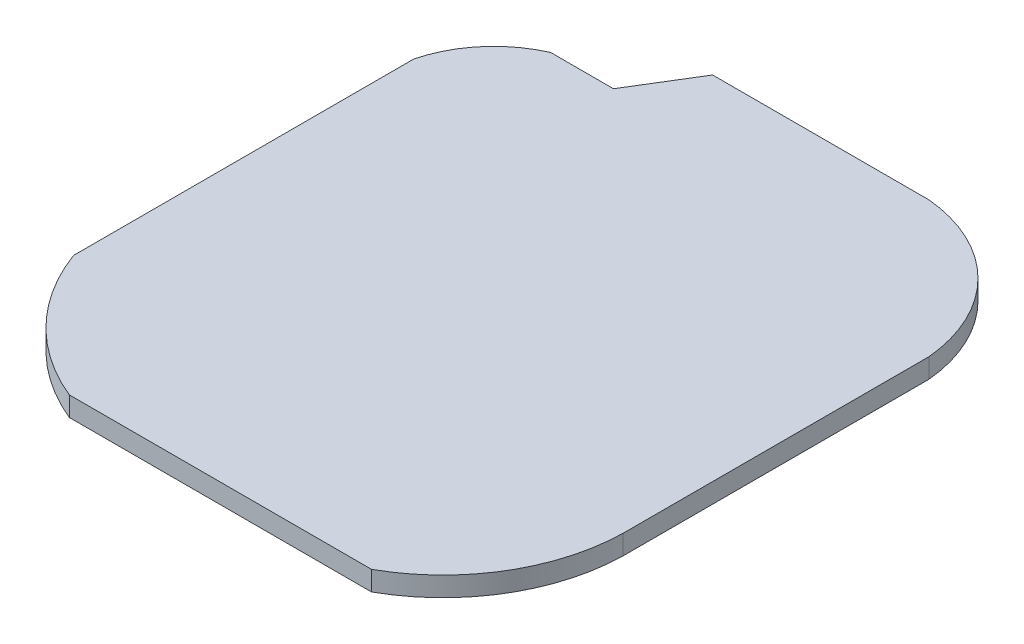
ISO-10303-21;
HEADER;
FILE_DESCRIPTION(('STEP AP214'),'2;1');
FILE_NAME('part.step','',(''),(''),'','','');
FILE_SCHEMA(('AUTOMOTIVE_DESIGN { 1 0 10303 214 1 1 1 1 }'));
ENDSEC;
DATA;
#1=APPLICATION_CONTEXT('core data for automotive mechanical design processes');
#2=APPLICATION_PROTOCOL_DEFINITION('international standard','automotive_design',2000,#1);
#3=PRODUCT_CONTEXT('',#1,'mechanical');
#4=PRODUCT('Part','Part','',(#3));
#5=PRODUCT_RELATED_PRODUCT_CATEGORY('part','',(#4));
#6=PRODUCT_DEFINITION_FORMATION('','',#4);
#7=PRODUCT_DEFINITION_CONTEXT('part definition',#1,'design');
#8=PRODUCT_DEFINITION('design','',#6,#7);
#9=PRODUCT_DEFINITION_SHAPE('','',#8);
#10=(LENGTH_UNIT() NAMED_UNIT(*) SI_UNIT(.MILLI.,.METRE.));
#11=(NAMED_UNIT(*) PLANE_ANGLE_UNIT() SI_UNIT($,.RADIAN.));
#12=(NAMED_UNIT(*) SI_UNIT($,.STERADIAN.) SOLID_ANGLE_UNIT());
#13=UNCERTAINTY_MEASURE_WITH_UNIT(LENGTH_MEASURE(1.E-05),#10,'distance_accuracy_value','');
#14=(GEOMETRIC_REPRESENTATION_CONTEXT(3) GLOBAL_UNCERTAINTY_ASSIGNED_CONTEXT((#13)) GLOBAL_UNIT_ASSIGNED_CONTEXT((#10,
#11,#12)) REPRESENTATION_CONTEXT('',''));
#15=CARTESIAN_POINT('',(0.,0.,0.));
#16=DIRECTION('',(0.,0.,1.));
#17=DIRECTION('',(1.,0.,0.));
#18=AXIS2_PLACEMENT_3D('',#15,#16,#17);
#19=CARTESIAN_POINT('',(0.,10.,0.));
#20=DIRECTION('',(0.,-1.,0.));
#21=DIRECTION('',(0.,0.,-1.));
#22=AXIS2_PLACEMENT_3D('',#19,#20,#21);
#23=PLANE('',#22);
#24=DIRECTION('',(-1.,0.,0.));
#25=VECTOR('',#24,1.);
#26=CARTESIAN_POINT('',(-131.4,10.,-152.64));
#27=LINE('',#26,#25);
#28=CARTESIAN_POINT('',(62.2799999999993,10.,-152.64));
#29=VERTEX_POINT('',#28);
#30=CARTESIAN_POINT('',(-48.1593420898172,10.,-152.64));
#31=VERTEX_POINT('',#30);
#32=EDGE_CURVE('E158',#29,#31,#27,.T.);
#33=ORIENTED_EDGE('',*,*,#32,.T.);
#34=DIRECTION('',(-0.52196564210467,0.,0.852966510750721));
#35=VECTOR('',#34,1.);
#36=CARTESIAN_POINT('',(-102.996679913968,10.,-63.0279471565971));
#37=LINE('',#36,#35);
#38=CARTESIAN_POINT('',(-67.3454683106027,10.,-121.287125754525));
#39=VERTEX_POINT('',#38);
#40=EDGE_CURVE('E179',#31,#39,#37,.T.);
#41=ORIENTED_EDGE('',*,*,#40,.T.);
#42=DIRECTION('',(-1.,0.,0.));
#43=VECTOR('',#42,1.);
#44=CARTESIAN_POINT('',(0.,10.,-121.287125754525));
#45=LINE('',#44,#43);
#46=CARTESIAN_POINT('',(-99.3727341553014,10.,-121.287125754525));
#47=VERTEX_POINT('',#46);
#48=EDGE_CURVE('E176',#39,#47,#45,.T.);
#49=ORIENTED_EDGE('',*,*,#48,.T.);
#50=CARTESIAN_POINT('',(-76.5886532674374,10.,-69.5023380807909));
#51=DIRECTION('',(0.,1.,0.));
#52=DIRECTION('',(0.,0.,1.));
#53=AXIS2_PLACEMENT_3D('',#50,#51,#52);
#54=CIRCLE('',#53,56.5754237838167);
#55=CARTESIAN_POINT('',(-131.4,10.,-83.52));
#56=VERTEX_POINT('',#55);
#57=EDGE_CURVE('E43',#56,#47,#54,.F.);
#58=ORIENTED_EDGE('',*,*,#57,.F.);
#59=DIRECTION('',(0.,0.,1.));
#60=VECTOR('',#59,1.);
#61=CARTESIAN_POINT('',(-131.4,10.,152.64));
#62=LINE('',#61,#60);
#63=CARTESIAN_POINT('',(-131.4,10.,90.));
#64=VERTEX_POINT('',#63);
#65=EDGE_CURVE('E50',#56,#64,#62,.T.);
#66=ORIENTED_EDGE('',*,*,#65,.T.);
#67=CARTESIAN_POINT('',(-30.0902527311731,10.,52.7009336714775));
#68=DIRECTION('',(0.,1.,0.));
#69=DIRECTION('',(0.,0.,1.));
#70=AXIS2_PLACEMENT_3D('',#67,#68,#69);
#71=CIRCLE('',#70,107.957793793005);
#72=CARTESIAN_POINT('',(-70.92,10.,152.64));
#73=VERTEX_POINT('',#72);
#74=EDGE_CURVE('E165',#73,#64,#71,.F.);
#75=ORIENTED_EDGE('',*,*,#74,.F.);
#76=DIRECTION('',(1.,0.,0.));
#77=VECTOR('',#76,1.);
#78=CARTESIAN_POINT('',(-131.4,10.,152.64));
#79=LINE('',#78,#77);
#80=CARTESIAN_POINT('',(83.16,10.,152.64));
#81=VERTEX_POINT('',#80);
#82=EDGE_CURVE('E11',#73,#81,#79,.T.);
#83=ORIENTED_EDGE('',*,*,#82,.T.);
#84=CARTESIAN_POINT('',(37.7003567408536,10.,70.681476591326));
#85=DIRECTION('',(0.,1.,0.));
#86=DIRECTION('',(0.,0.,1.));
#87=AXIS2_PLACEMENT_3D('',#84,#85,#86);
#88=CIRCLE('',#87,93.721815627841);
#89=CARTESIAN_POINT('',(131.4,10.,72.72));
#90=VERTEX_POINT('',#89);
#91=EDGE_CURVE('E127',#90,#81,#88,.F.);
#92=ORIENTED_EDGE('',*,*,#91,.F.);
#93=DIRECTION('',(0.,0.,-1.));
#94=VECTOR('',#93,1.);
#95=CARTESIAN_POINT('',(131.4,10.,152.64));
#96=LINE('',#95,#94);
#97=CARTESIAN_POINT('',(131.4,10.,-83.52));
#98=VERTEX_POINT('',#97);
#99=EDGE_CURVE('E152',#90,#98,#96,.T.);
#100=ORIENTED_EDGE('',*,*,#99,.T.);
#101=CARTESIAN_POINT('',(55.0799999999997,10.,-76.3199999999996));
#102=DIRECTION('',(0.,1.,0.));
#103=DIRECTION('',(0.,0.,1.));
#104=AXIS2_PLACEMENT_3D('',#101,#102,#103);
#105=CIRCLE('',#104,76.6588703282279);
#106=EDGE_CURVE('E170',#29,#98,#105,.F.);
#107=ORIENTED_EDGE('',*,*,#106,.F.);
#108=EDGE_LOOP('',(#33,#41,#49,#58,#66,#75,#83,#92,#100,#107));
#109=FACE_BOUND('',#108,.T.);
#110=ADVANCED_FACE('F39',(#109),#23,.F.);
#111=CARTESIAN_POINT('',(0.,0.,0.));
#112=DIRECTION('',(0.,-1.,0.));
#113=DIRECTION('',(0.,0.,-1.));
#114=AXIS2_PLACEMENT_3D('',#111,#112,#113);
#115=PLANE('',#114);
#116=DIRECTION('',(0.52196564210467,0.,-0.852966510750721));
#117=VECTOR('',#116,1.);
#118=CARTESIAN_POINT('',(-67.3454683106027,0.,-121.287125754525));
#119=LINE('',#118,#117);
#120=CARTESIAN_POINT('',(-67.3454683106027,0.,-121.287125754525));
#121=VERTEX_POINT('',#120);
#122=CARTESIAN_POINT('',(-48.1593420898172,0.,-152.64));
#123=VERTEX_POINT('',#122);
#124=EDGE_CURVE('E207',#121,#123,#119,.T.);
#125=ORIENTED_EDGE('',*,*,#124,.T.);
#126=DIRECTION('',(-1.,0.,0.));
#127=VECTOR('',#126,1.);
#128=CARTESIAN_POINT('',(-131.4,0.,-152.64));
#129=LINE('',#128,#127);
#130=CARTESIAN_POINT('',(62.2799999999992,0.,-152.64));
#131=VERTEX_POINT('',#130);
#132=EDGE_CURVE('E161',#131,#123,#129,.T.);
#133=ORIENTED_EDGE('',*,*,#132,.F.);
#134=CARTESIAN_POINT('',(55.0799999999997,0.,-76.3199999999996));
#135=DIRECTION('',(0.,-1.,0.));
#136=DIRECTION('',(0.,0.,-1.));
#137=AXIS2_PLACEMENT_3D('',#134,#135,#136);
#138=CIRCLE('',#137,76.6588703282279);
#139=CARTESIAN_POINT('',(131.4,0.,-83.52));
#140=VERTEX_POINT('',#139);
#141=EDGE_CURVE('E205',#131,#140,#138,.T.);
#142=ORIENTED_EDGE('',*,*,#141,.T.);
#143=DIRECTION('',(0.,0.,-1.));
#144=VECTOR('',#143,1.);
#145=CARTESIAN_POINT('',(131.4,0.,152.64));
#146=LINE('',#145,#144);
#147=CARTESIAN_POINT('',(131.4,0.,72.72));
#148=VERTEX_POINT('',#147);
#149=EDGE_CURVE('E144',#148,#140,#146,.T.);
#150=ORIENTED_EDGE('',*,*,#149,.F.);
#151=CARTESIAN_POINT('',(37.7003567408536,0.,70.681476591326));
#152=DIRECTION('',(0.,-1.,0.));
#153=DIRECTION('',(0.,0.,1.));
#154=AXIS2_PLACEMENT_3D('',#151,#152,#153);
#155=CIRCLE('',#154,93.721815627841);
#156=CARTESIAN_POINT('',(83.16,0.,152.64));
#157=VERTEX_POINT('',#156);
#158=EDGE_CURVE('E124',#148,#157,#155,.T.);
#159=ORIENTED_EDGE('',*,*,#158,.T.);
#160=DIRECTION('',(1.,0.,0.));
#161=VECTOR('',#160,1.);
#162=CARTESIAN_POINT('',(-131.4,0.,152.64));
#163=LINE('',#162,#161);
#164=CARTESIAN_POINT('',(-70.92,0.,152.64));
#165=VERTEX_POINT('',#164);
#166=EDGE_CURVE('E141',#165,#157,#163,.T.);
#167=ORIENTED_EDGE('',*,*,#166,.F.);
#168=CARTESIAN_POINT('',(-30.0902527311731,0.,52.7009336714775));
#169=DIRECTION('',(0.,-1.,0.));
#170=DIRECTION('',(0.,0.,-1.));
#171=AXIS2_PLACEMENT_3D('',#168,#169,#170);
#172=CIRCLE('',#171,107.957793793005);
#173=CARTESIAN_POINT('',(-131.4,0.,90.));
#174=VERTEX_POINT('',#173);
#175=EDGE_CURVE('E132',#165,#174,#172,.T.);
#176=ORIENTED_EDGE('',*,*,#175,.T.);
#177=DIRECTION('',(0.,0.,1.));
#178=VECTOR('',#177,1.);
#179=CARTESIAN_POINT('',(-131.4,0.,152.64));
#180=LINE('',#179,#178);
#181=CARTESIAN_POINT('',(-131.4,0.,-83.52));
#182=VERTEX_POINT('',#181);
#183=EDGE_CURVE('E153',#182,#174,#180,.T.);
#184=ORIENTED_EDGE('',*,*,#183,.F.);
#185=CARTESIAN_POINT('',(-76.5886532674374,0.,-69.5023380807909));
#186=DIRECTION('',(0.,-1.,0.));
#187=DIRECTION('',(0.,0.,-1.));
#188=AXIS2_PLACEMENT_3D('',#185,#186,#187);
#189=CIRCLE('',#188,56.5754237838167);
#190=CARTESIAN_POINT('',(-99.3727341553014,0.,-121.287125754525));
#191=VERTEX_POINT('',#190);
#192=EDGE_CURVE('E101',#182,#191,#189,.T.);
#193=ORIENTED_EDGE('',*,*,#192,.T.);
#194=DIRECTION('',(1.,0.,0.));
#195=VECTOR('',#194,1.);
#196=CARTESIAN_POINT('',(-99.3727341553014,0.,-121.287125754525));
#197=LINE('',#196,#195);
#198=EDGE_CURVE('E59',#191,#121,#197,.T.);
#199=ORIENTED_EDGE('',*,*,#198,.T.);
#200=EDGE_LOOP('',(#125,#133,#142,#150,#159,#167,#176,#184,#193,#199));
#201=FACE_BOUND('',#200,.T.);
#202=ADVANCED_FACE('F139',(#201),#115,.T.);
#203=CARTESIAN_POINT('',(131.4,10.,152.64));
#204=DIRECTION('',(-1.,0.,0.));
#205=DIRECTION('',(0.,0.,1.));
#206=AXIS2_PLACEMENT_3D('',#203,#204,#205);
#207=PLANE('',#206);
#208=ORIENTED_EDGE('',*,*,#149,.T.);
#209=DIRECTION('',(0.,1.,0.));
#210=VECTOR('',#209,1.);
#211=CARTESIAN_POINT('',(131.4,0.,-83.52));
#212=LINE('',#211,#210);
#213=EDGE_CURVE('E209',#140,#98,#212,.T.);
#214=ORIENTED_EDGE('',*,*,#213,.T.);
#215=ORIENTED_EDGE('',*,*,#99,.F.);
#216=DIRECTION('',(0.,1.,0.));
#217=VECTOR('',#216,1.);
#218=CARTESIAN_POINT('',(131.4,0.,72.72));
#219=LINE('',#218,#217);
#220=EDGE_CURVE('E133',#148,#90,#219,.T.);
#221=ORIENTED_EDGE('',*,*,#220,.F.);
#222=EDGE_LOOP('',(#208,#214,#215,#221));
#223=FACE_BOUND('',#222,.T.);
#224=ADVANCED_FACE('F41',(#223),#207,.F.);
#225=CARTESIAN_POINT('',(-131.4,10.,-152.64));
#226=DIRECTION('',(0.,0.,1.));
#227=DIRECTION('',(1.,0.,0.));
#228=AXIS2_PLACEMENT_3D('',#225,#226,#227);
#229=PLANE('',#228);
#230=ORIENTED_EDGE('',*,*,#132,.T.);
#231=DIRECTION('',(0.,1.,0.));
#232=VECTOR('',#231,1.);
#233=CARTESIAN_POINT('',(-48.1593420898172,0.,-152.64));
#234=LINE('',#233,#232);
#235=EDGE_CURVE('E203',#123,#31,#234,.T.);
#236=ORIENTED_EDGE('',*,*,#235,.T.);
#237=ORIENTED_EDGE('',*,*,#32,.F.);
#238=DIRECTION('',(0.,1.,0.));
#239=VECTOR('',#238,1.);
#240=CARTESIAN_POINT('',(62.2799999999992,0.,-152.64));
#241=LINE('',#240,#239);
#242=EDGE_CURVE('E146',#131,#29,#241,.T.);
#243=ORIENTED_EDGE('',*,*,#242,.F.);
#244=EDGE_LOOP('',(#230,#236,#237,#243));
#245=FACE_BOUND('',#244,.T.);
#246=ADVANCED_FACE('F201',(#245),#229,.F.);
#247=CARTESIAN_POINT('',(-131.4,10.,152.64));
#248=DIRECTION('',(1.,0.,0.));
#249=DIRECTION('',(0.,0.,-1.));
#250=AXIS2_PLACEMENT_3D('',#247,#248,#249);
#251=PLANE('',#250);
#252=ORIENTED_EDGE('',*,*,#65,.F.);
#253=DIRECTION('',(0.,1.,0.));
#254=VECTOR('',#253,1.);
#255=CARTESIAN_POINT('',(-131.4,0.,-83.52));
#256=LINE('',#255,#254);
#257=EDGE_CURVE('E93',#182,#56,#256,.T.);
#258=ORIENTED_EDGE('',*,*,#257,.F.);
#259=ORIENTED_EDGE('',*,*,#183,.T.);
#260=DIRECTION('',(0.,1.,0.));
#261=VECTOR('',#260,1.);
#262=CARTESIAN_POINT('',(-131.4,0.,90.));
#263=LINE('',#262,#261);
#264=EDGE_CURVE('E168',#174,#64,#263,.T.);
#265=ORIENTED_EDGE('',*,*,#264,.T.);
#266=EDGE_LOOP('',(#252,#258,#259,#265));
#267=FACE_BOUND('',#266,.T.);
#268=ADVANCED_FACE('F242',(#267),#251,.F.);
#269=CARTESIAN_POINT('',(-131.4,10.,152.64));
#270=DIRECTION('',(0.,0.,-1.));
#271=DIRECTION('',(-1.,0.,0.));
#272=AXIS2_PLACEMENT_3D('',#269,#270,#271);
#273=PLANE('',#272);
#274=ORIENTED_EDGE('',*,*,#166,.T.);
#275=DIRECTION('',(0.,1.,0.));
#276=VECTOR('',#275,1.);
#277=CARTESIAN_POINT('',(83.16,0.,152.64));
#278=LINE('',#277,#276);
#279=EDGE_CURVE('E121',#157,#81,#278,.T.);
#280=ORIENTED_EDGE('',*,*,#279,.T.);
#281=ORIENTED_EDGE('',*,*,#82,.F.);
#282=DIRECTION('',(0.,1.,0.));
#283=VECTOR('',#282,1.);
#284=CARTESIAN_POINT('',(-70.92,0.,152.64));
#285=LINE('',#284,#283);
#286=EDGE_CURVE('E150',#165,#73,#285,.T.);
#287=ORIENTED_EDGE('',*,*,#286,.F.);
#288=EDGE_LOOP('',(#274,#280,#281,#287));
#289=FACE_BOUND('',#288,.T.);
#290=ADVANCED_FACE('F149',(#289),#273,.F.);
#291=CARTESIAN_POINT('',(-30.0902527311731,0.,52.7009336714775));
#292=DIRECTION('',(0.,1.,0.));
#293=DIRECTION('',(0.,0.,1.));
#294=AXIS2_PLACEMENT_3D('',#291,#292,#293);
#295=CYLINDRICAL_SURFACE('',#294,107.957793793005);
#296=ORIENTED_EDGE('',*,*,#264,.F.);
#297=ORIENTED_EDGE('',*,*,#175,.F.);
#298=ORIENTED_EDGE('',*,*,#286,.T.);
#299=ORIENTED_EDGE('',*,*,#74,.T.);
#300=EDGE_LOOP('',(#296,#297,#298,#299));
#301=FACE_BOUND('',#300,.T.);
#302=ADVANCED_FACE('F244',(#301),#295,.T.);
#303=CARTESIAN_POINT('',(37.7003567408536,0.,70.681476591326));
#304=DIRECTION('',(0.,1.,0.));
#305=DIRECTION('',(0.,0.,1.));
#306=AXIS2_PLACEMENT_3D('',#303,#304,#305);
#307=CYLINDRICAL_SURFACE('',#306,93.721815627841);
#308=ORIENTED_EDGE('',*,*,#279,.F.);
#309=ORIENTED_EDGE('',*,*,#158,.F.);
#310=ORIENTED_EDGE('',*,*,#220,.T.);
#311=ORIENTED_EDGE('',*,*,#91,.T.);
#312=EDGE_LOOP('',(#308,#309,#310,#311));
#313=FACE_BOUND('',#312,.T.);
#314=ADVANCED_FACE('F123',(#313),#307,.T.);
#315=CARTESIAN_POINT('',(55.0799999999997,0.,-76.3199999999996));
#316=DIRECTION('',(0.,1.,0.));
#317=DIRECTION('',(0.,0.,1.));
#318=AXIS2_PLACEMENT_3D('',#315,#316,#317);
#319=CYLINDRICAL_SURFACE('',#318,76.6588703282279);
#320=ORIENTED_EDGE('',*,*,#213,.F.);
#321=ORIENTED_EDGE('',*,*,#141,.F.);
#322=ORIENTED_EDGE('',*,*,#242,.T.);
#323=ORIENTED_EDGE('',*,*,#106,.T.);
#324=EDGE_LOOP('',(#320,#321,#322,#323));
#325=FACE_BOUND('',#324,.T.);
#326=ADVANCED_FACE('F208',(#325),#319,.T.);
#327=CARTESIAN_POINT('',(-67.3454683106027,0.,-121.287125754525));
#328=DIRECTION('',(0.852966510750721,0.,0.52196564210467));
#329=DIRECTION('',(0.52196564210467,0.,-0.852966510750721));
#330=AXIS2_PLACEMENT_3D('',#327,#328,#329);
#331=PLANE('',#330);
#332=ORIENTED_EDGE('',*,*,#235,.F.);
#333=ORIENTED_EDGE('',*,*,#124,.F.);
#334=DIRECTION('',(0.,1.,0.));
#335=VECTOR('',#334,1.);
#336=CARTESIAN_POINT('',(-67.3454683106027,0.,-121.287125754525));
#337=LINE('',#336,#335);
#338=EDGE_CURVE('E215',#121,#39,#337,.T.);
#339=ORIENTED_EDGE('',*,*,#338,.T.);
#340=ORIENTED_EDGE('',*,*,#40,.F.);
#341=EDGE_LOOP('',(#332,#333,#339,#340));
#342=FACE_BOUND('',#341,.T.);
#343=ADVANCED_FACE('F272',(#342),#331,.F.);
#344=CARTESIAN_POINT('',(-99.3727341553014,0.,-121.287125754525));
#345=DIRECTION('',(0.,0.,1.));
#346=DIRECTION('',(1.,0.,0.));
#347=AXIS2_PLACEMENT_3D('',#344,#345,#346);
#348=PLANE('',#347);
#349=ORIENTED_EDGE('',*,*,#338,.F.);
#350=ORIENTED_EDGE('',*,*,#198,.F.);
#351=DIRECTION('',(0.,1.,0.));
#352=VECTOR('',#351,1.);
#353=CARTESIAN_POINT('',(-99.3727341553014,0.,-121.287125754525));
#354=LINE('',#353,#352);
#355=EDGE_CURVE('E97',#191,#47,#354,.T.);
#356=ORIENTED_EDGE('',*,*,#355,.T.);
#357=ORIENTED_EDGE('',*,*,#48,.F.);
#358=EDGE_LOOP('',(#349,#350,#356,#357));
#359=FACE_BOUND('',#358,.T.);
#360=ADVANCED_FACE('F273',(#359),#348,.F.);
#361=CARTESIAN_POINT('',(-76.5886532674374,0.,-69.5023380807909));
#362=DIRECTION('',(0.,1.,0.));
#363=DIRECTION('',(0.,0.,1.));
#364=AXIS2_PLACEMENT_3D('',#361,#362,#363);
#365=CYLINDRICAL_SURFACE('',#364,56.5754237838167);
#366=ORIENTED_EDGE('',*,*,#355,.F.);
#367=ORIENTED_EDGE('',*,*,#192,.F.);
#368=ORIENTED_EDGE('',*,*,#257,.T.);
#369=ORIENTED_EDGE('',*,*,#57,.T.);
#370=EDGE_LOOP('',(#366,#367,#368,#369));
#371=FACE_BOUND('',#370,.T.);
#372=ADVANCED_FACE('F275',(#371),#365,.T.);
#373=CLOSED_SHELL('',(#110,#202,#224,#246,#268,#290,#302,#314,#326,#343,#360,#372));
#374=MANIFOLD_SOLID_BREP('B2',#373);
#375=ADVANCED_BREP_SHAPE_REPRESENTATION('',(#18,#374),#14);
#376=SHAPE_DEFINITION_REPRESENTATION(#9,#375);
ENDSEC;
END-ISO-10303-21;
